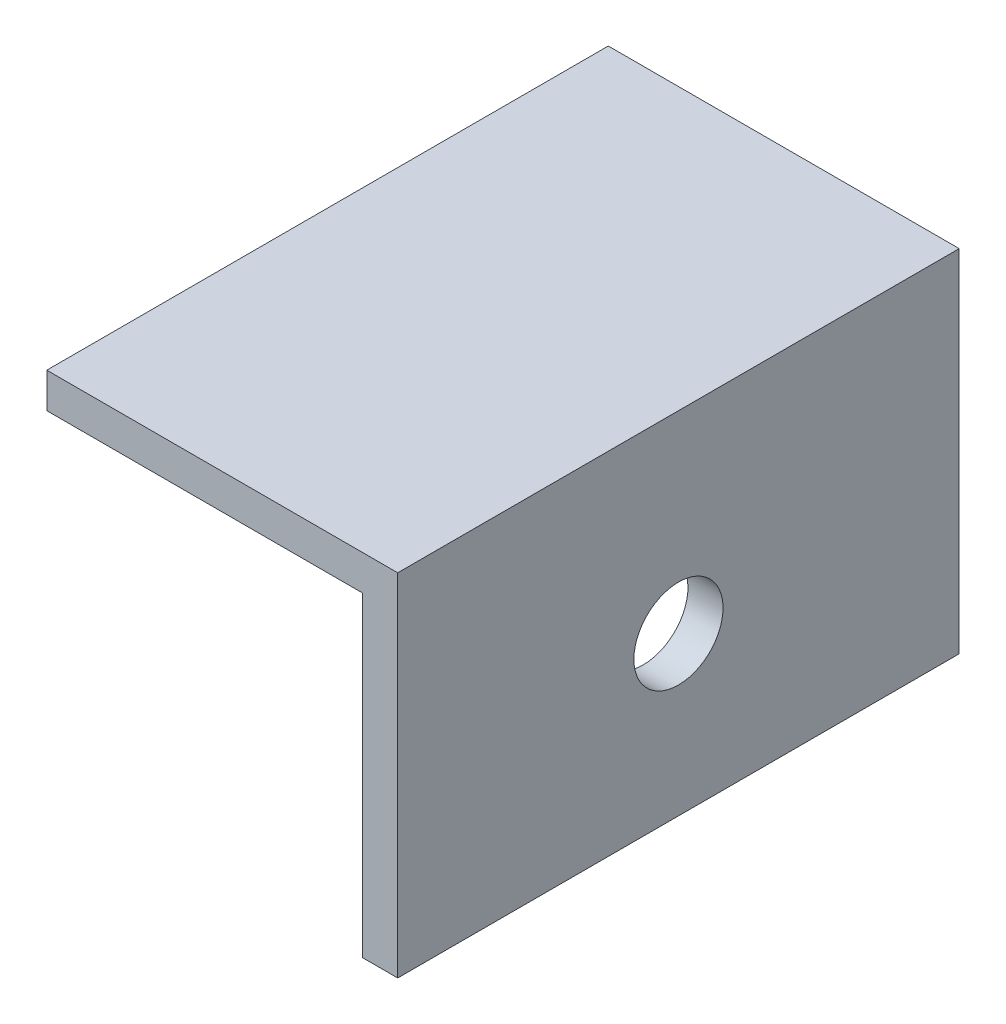
ISO-10303-21;
HEADER;
FILE_DESCRIPTION(('STEP AP214'),'2;1');
FILE_NAME('part.step','',(''),(''),'','','');
FILE_SCHEMA(('AUTOMOTIVE_DESIGN { 1 0 10303 214 1 1 1 1 }'));
ENDSEC;
DATA;
#1=APPLICATION_CONTEXT('core data for automotive mechanical design processes');
#2=APPLICATION_PROTOCOL_DEFINITION('international standard','automotive_design',2000,#1);
#3=PRODUCT_CONTEXT('',#1,'mechanical');
#4=PRODUCT('Part','Part','',(#3));
#5=PRODUCT_RELATED_PRODUCT_CATEGORY('part','',(#4));
#6=PRODUCT_DEFINITION_FORMATION('','',#4);
#7=PRODUCT_DEFINITION_CONTEXT('part definition',#1,'design');
#8=PRODUCT_DEFINITION('design','',#6,#7);
#9=PRODUCT_DEFINITION_SHAPE('','',#8);
#10=(LENGTH_UNIT() NAMED_UNIT(*) SI_UNIT(.MILLI.,.METRE.));
#11=(NAMED_UNIT(*) PLANE_ANGLE_UNIT() SI_UNIT($,.RADIAN.));
#12=(NAMED_UNIT(*) SI_UNIT($,.STERADIAN.) SOLID_ANGLE_UNIT());
#13=UNCERTAINTY_MEASURE_WITH_UNIT(LENGTH_MEASURE(1.E-05),#10,'distance_accuracy_value','');
#14=(GEOMETRIC_REPRESENTATION_CONTEXT(3) GLOBAL_UNCERTAINTY_ASSIGNED_CONTEXT((#13)) GLOBAL_UNIT_ASSIGNED_CONTEXT((#10,
#11,#12)) REPRESENTATION_CONTEXT('',''));
#15=CARTESIAN_POINT('',(0.,0.,0.));
#16=DIRECTION('',(0.,0.,1.));
#17=DIRECTION('',(1.,0.,0.));
#18=AXIS2_PLACEMENT_3D('',#15,#16,#17);
#19=CARTESIAN_POINT('',(-5.,0.,80.));
#20=DIRECTION('',(0.,1.,0.));
#21=DIRECTION('',(0.,0.,1.));
#22=AXIS2_PLACEMENT_3D('',#19,#20,#21);
#23=PLANE('',#22);
#24=DIRECTION('',(1.,0.,0.));
#25=VECTOR('',#24,1.);
#26=CARTESIAN_POINT('',(-5.,0.,0.));
#27=LINE('',#26,#25);
#28=CARTESIAN_POINT('',(-5.,0.,0.));
#29=VERTEX_POINT('',#28);
#30=CARTESIAN_POINT('',(0.,0.,0.));
#31=VERTEX_POINT('',#30);
#32=EDGE_CURVE('E128',#29,#31,#27,.T.);
#33=ORIENTED_EDGE('',*,*,#32,.T.);
#34=DIRECTION('',(0.,0.,-1.));
#35=VECTOR('',#34,1.);
#36=CARTESIAN_POINT('',(0.,0.,80.));
#37=LINE('',#36,#35);
#38=CARTESIAN_POINT('',(0.,0.,80.));
#39=VERTEX_POINT('',#38);
#40=EDGE_CURVE('E11',#39,#31,#37,.T.);
#41=ORIENTED_EDGE('',*,*,#40,.F.);
#42=DIRECTION('',(1.,0.,0.));
#43=VECTOR('',#42,1.);
#44=CARTESIAN_POINT('',(-5.,0.,80.));
#45=LINE('',#44,#43);
#46=CARTESIAN_POINT('',(-5.,0.,80.));
#47=VERTEX_POINT('',#46);
#48=EDGE_CURVE('E145',#47,#39,#45,.T.);
#49=ORIENTED_EDGE('',*,*,#48,.F.);
#50=DIRECTION('',(0.,0.,-1.));
#51=VECTOR('',#50,1.);
#52=CARTESIAN_POINT('',(-5.,0.,80.));
#53=LINE('',#52,#51);
#54=EDGE_CURVE('E124',#47,#29,#53,.T.);
#55=ORIENTED_EDGE('',*,*,#54,.T.);
#56=EDGE_LOOP('',(#33,#41,#49,#55));
#57=FACE_BOUND('',#56,.T.);
#58=ADVANCED_FACE('F39',(#57),#23,.F.);
#59=CARTESIAN_POINT('',(0.,0.,80.));
#60=DIRECTION('',(-1.,0.,0.));
#61=DIRECTION('',(0.,0.,1.));
#62=AXIS2_PLACEMENT_3D('',#59,#60,#61);
#63=PLANE('',#62);
#64=CARTESIAN_POINT('',(0.,22.5,40.));
#65=DIRECTION('',(-1.,0.,0.));
#66=DIRECTION('',(0.,0.,1.));
#67=AXIS2_PLACEMENT_3D('',#64,#65,#66);
#68=CIRCLE('',#67,6.35);
#69=CARTESIAN_POINT('',(0.,22.5,46.35));
#70=VERTEX_POINT('',#69);
#71=EDGE_CURVE('E133',#70,#70,#68,.F.);
#72=ORIENTED_EDGE('',*,*,#71,.F.);
#73=EDGE_LOOP('',(#72));
#74=FACE_BOUND('',#73,.T.);
#75=DIRECTION('',(0.,1.,0.));
#76=VECTOR('',#75,1.);
#77=CARTESIAN_POINT('',(0.,0.,0.));
#78=LINE('',#77,#76);
#79=CARTESIAN_POINT('',(0.,50.,0.));
#80=VERTEX_POINT('',#79);
#81=EDGE_CURVE('E132',#31,#80,#78,.T.);
#82=ORIENTED_EDGE('',*,*,#81,.T.);
#83=DIRECTION('',(0.,0.,-1.));
#84=VECTOR('',#83,1.);
#85=CARTESIAN_POINT('',(0.,50.,80.));
#86=LINE('',#85,#84);
#87=CARTESIAN_POINT('',(0.,50.,80.));
#88=VERTEX_POINT('',#87);
#89=EDGE_CURVE('E48',#88,#80,#86,.T.);
#90=ORIENTED_EDGE('',*,*,#89,.F.);
#91=DIRECTION('',(0.,1.,0.));
#92=VECTOR('',#91,1.);
#93=CARTESIAN_POINT('',(0.,0.,80.));
#94=LINE('',#93,#92);
#95=EDGE_CURVE('E93',#39,#88,#94,.T.);
#96=ORIENTED_EDGE('',*,*,#95,.F.);
#97=ORIENTED_EDGE('',*,*,#40,.T.);
#98=EDGE_LOOP('',(#82,#90,#96,#97));
#99=FACE_BOUND('',#98,.T.);
#100=ADVANCED_FACE('F175',(#74,#99),#63,.F.);
#101=CARTESIAN_POINT('',(0.,50.,80.));
#102=DIRECTION('',(0.,-1.,0.));
#103=DIRECTION('',(1.,0.,0.));
#104=AXIS2_PLACEMENT_3D('',#101,#102,#103);
#105=PLANE('',#104);
#106=DIRECTION('',(-1.,0.,0.));
#107=VECTOR('',#106,1.);
#108=CARTESIAN_POINT('',(0.,50.,0.));
#109=LINE('',#108,#107);
#110=CARTESIAN_POINT('',(-50.,50.,0.));
#111=VERTEX_POINT('',#110);
#112=EDGE_CURVE('E136',#80,#111,#109,.T.);
#113=ORIENTED_EDGE('',*,*,#112,.T.);
#114=DIRECTION('',(0.,0.,-1.));
#115=VECTOR('',#114,1.);
#116=CARTESIAN_POINT('',(-50.,50.,80.));
#117=LINE('',#116,#115);
#118=CARTESIAN_POINT('',(-50.,50.,80.));
#119=VERTEX_POINT('',#118);
#120=EDGE_CURVE('E117',#119,#111,#117,.T.);
#121=ORIENTED_EDGE('',*,*,#120,.F.);
#122=DIRECTION('',(-1.,0.,0.));
#123=VECTOR('',#122,1.);
#124=CARTESIAN_POINT('',(0.,50.,80.));
#125=LINE('',#124,#123);
#126=EDGE_CURVE('E106',#88,#119,#125,.T.);
#127=ORIENTED_EDGE('',*,*,#126,.F.);
#128=ORIENTED_EDGE('',*,*,#89,.T.);
#129=EDGE_LOOP('',(#113,#121,#127,#128));
#130=FACE_BOUND('',#129,.T.);
#131=ADVANCED_FACE('F155',(#130),#105,.F.);
#132=CARTESIAN_POINT('',(-50.,50.,80.));
#133=DIRECTION('',(1.,0.,0.));
#134=DIRECTION('',(0.,0.,-1.));
#135=AXIS2_PLACEMENT_3D('',#132,#133,#134);
#136=PLANE('',#135);
#137=DIRECTION('',(0.,-1.,0.));
#138=VECTOR('',#137,1.);
#139=CARTESIAN_POINT('',(-50.,50.,0.));
#140=LINE('',#139,#138);
#141=CARTESIAN_POINT('',(-50.,45.,0.));
#142=VERTEX_POINT('',#141);
#143=EDGE_CURVE('E115',#111,#142,#140,.T.);
#144=ORIENTED_EDGE('',*,*,#143,.T.);
#145=DIRECTION('',(0.,0.,-1.));
#146=VECTOR('',#145,1.);
#147=CARTESIAN_POINT('',(-50.,45.,80.));
#148=LINE('',#147,#146);
#149=CARTESIAN_POINT('',(-50.,45.,80.));
#150=VERTEX_POINT('',#149);
#151=EDGE_CURVE('E112',#150,#142,#148,.T.);
#152=ORIENTED_EDGE('',*,*,#151,.F.);
#153=DIRECTION('',(0.,-1.,0.));
#154=VECTOR('',#153,1.);
#155=CARTESIAN_POINT('',(-50.,50.,80.));
#156=LINE('',#155,#154);
#157=EDGE_CURVE('E100',#119,#150,#156,.T.);
#158=ORIENTED_EDGE('',*,*,#157,.F.);
#159=ORIENTED_EDGE('',*,*,#120,.T.);
#160=EDGE_LOOP('',(#144,#152,#158,#159));
#161=FACE_BOUND('',#160,.T.);
#162=ADVANCED_FACE('F113',(#161),#136,.F.);
#163=CARTESIAN_POINT('',(-50.,45.,80.));
#164=DIRECTION('',(0.,1.,0.));
#165=DIRECTION('',(0.,0.,1.));
#166=AXIS2_PLACEMENT_3D('',#163,#164,#165);
#167=PLANE('',#166);
#168=DIRECTION('',(1.,0.,0.));
#169=VECTOR('',#168,1.);
#170=CARTESIAN_POINT('',(-50.,45.,0.));
#171=LINE('',#170,#169);
#172=CARTESIAN_POINT('',(-5.,45.,0.));
#173=VERTEX_POINT('',#172);
#174=EDGE_CURVE('E79',#142,#173,#171,.T.);
#175=ORIENTED_EDGE('',*,*,#174,.T.);
#176=DIRECTION('',(0.,0.,-1.));
#177=VECTOR('',#176,1.);
#178=CARTESIAN_POINT('',(-5.,45.,80.));
#179=LINE('',#178,#177);
#180=CARTESIAN_POINT('',(-5.,45.,80.));
#181=VERTEX_POINT('',#180);
#182=EDGE_CURVE('E118',#181,#173,#179,.T.);
#183=ORIENTED_EDGE('',*,*,#182,.F.);
#184=DIRECTION('',(1.,0.,0.));
#185=VECTOR('',#184,1.);
#186=CARTESIAN_POINT('',(-50.,45.,80.));
#187=LINE('',#186,#185);
#188=EDGE_CURVE('E104',#150,#181,#187,.T.);
#189=ORIENTED_EDGE('',*,*,#188,.F.);
#190=ORIENTED_EDGE('',*,*,#151,.T.);
#191=EDGE_LOOP('',(#175,#183,#189,#190));
#192=FACE_BOUND('',#191,.T.);
#193=ADVANCED_FACE('F120',(#192),#167,.F.);
#194=CARTESIAN_POINT('',(-5.,45.,80.));
#195=DIRECTION('',(1.,0.,0.));
#196=DIRECTION('',(0.,1.,0.));
#197=AXIS2_PLACEMENT_3D('',#194,#195,#196);
#198=PLANE('',#197);
#199=CARTESIAN_POINT('',(-5.,22.5,40.));
#200=DIRECTION('',(-1.,0.,0.));
#201=DIRECTION('',(0.,-1.,0.));
#202=AXIS2_PLACEMENT_3D('',#199,#200,#201);
#203=CIRCLE('',#202,6.35);
#204=CARTESIAN_POINT('',(-5.,16.15,40.));
#205=VERTEX_POINT('',#204);
#206=EDGE_CURVE('E234',#205,#205,#203,.T.);
#207=ORIENTED_EDGE('',*,*,#206,.F.);
#208=EDGE_LOOP('',(#207));
#209=FACE_BOUND('',#208,.T.);
#210=DIRECTION('',(0.,-1.,0.));
#211=VECTOR('',#210,1.);
#212=CARTESIAN_POINT('',(-5.,45.,0.));
#213=LINE('',#212,#211);
#214=EDGE_CURVE('E85',#173,#29,#213,.T.);
#215=ORIENTED_EDGE('',*,*,#214,.T.);
#216=ORIENTED_EDGE('',*,*,#54,.F.);
#217=DIRECTION('',(0.,-1.,0.));
#218=VECTOR('',#217,1.);
#219=CARTESIAN_POINT('',(-5.,45.,80.));
#220=LINE('',#219,#218);
#221=EDGE_CURVE('E56',#181,#47,#220,.T.);
#222=ORIENTED_EDGE('',*,*,#221,.F.);
#223=ORIENTED_EDGE('',*,*,#182,.T.);
#224=EDGE_LOOP('',(#215,#216,#222,#223));
#225=FACE_BOUND('',#224,.T.);
#226=ADVANCED_FACE('F162',(#209,#225),#198,.F.);
#227=CARTESIAN_POINT('',(0.,0.,80.));
#228=DIRECTION('',(0.,0.,1.));
#229=DIRECTION('',(1.,0.,0.));
#230=AXIS2_PLACEMENT_3D('',#227,#228,#229);
#231=PLANE('',#230);
#232=ORIENTED_EDGE('',*,*,#48,.T.);
#233=ORIENTED_EDGE('',*,*,#95,.T.);
#234=ORIENTED_EDGE('',*,*,#126,.T.);
#235=ORIENTED_EDGE('',*,*,#157,.T.);
#236=ORIENTED_EDGE('',*,*,#188,.T.);
#237=ORIENTED_EDGE('',*,*,#221,.T.);
#238=EDGE_LOOP('',(#232,#233,#234,#235,#236,#237));
#239=FACE_BOUND('',#238,.T.);
#240=ADVANCED_FACE('F102',(#239),#231,.T.);
#241=CARTESIAN_POINT('',(0.,0.,0.));
#242=DIRECTION('',(0.,0.,1.));
#243=DIRECTION('',(1.,0.,0.));
#244=AXIS2_PLACEMENT_3D('',#241,#242,#243);
#245=PLANE('',#244);
#246=ORIENTED_EDGE('',*,*,#32,.F.);
#247=ORIENTED_EDGE('',*,*,#214,.F.);
#248=ORIENTED_EDGE('',*,*,#174,.F.);
#249=ORIENTED_EDGE('',*,*,#143,.F.);
#250=ORIENTED_EDGE('',*,*,#112,.F.);
#251=ORIENTED_EDGE('',*,*,#81,.F.);
#252=EDGE_LOOP('',(#246,#247,#248,#249,#250,#251));
#253=FACE_BOUND('',#252,.T.);
#254=ADVANCED_FACE('F158',(#253),#245,.F.);
#255=CARTESIAN_POINT('',(0.00100000000000273,22.5,40.));
#256=DIRECTION('',(-1.,0.,0.));
#257=DIRECTION('',(0.,-1.,0.));
#258=AXIS2_PLACEMENT_3D('',#255,#256,#257);
#259=CYLINDRICAL_SURFACE('',#258,6.35);
#260=ORIENTED_EDGE('',*,*,#206,.T.);
#261=EDGE_LOOP('',(#260));
#262=FACE_BOUND('',#261,.T.);
#263=ORIENTED_EDGE('',*,*,#71,.T.);
#264=EDGE_LOOP('',(#263));
#265=FACE_BOUND('',#264,.T.);
#266=ADVANCED_FACE('F210',(#262,#265),#259,.F.);
#267=CLOSED_SHELL('',(#58,#100,#131,#162,#193,#226,#240,#254,#266));
#268=MANIFOLD_SOLID_BREP('B2',#267);
#269=ADVANCED_BREP_SHAPE_REPRESENTATION('',(#18,#268),#14);
#270=SHAPE_DEFINITION_REPRESENTATION(#9,#269);
ENDSEC;
END-ISO-10303-21;
